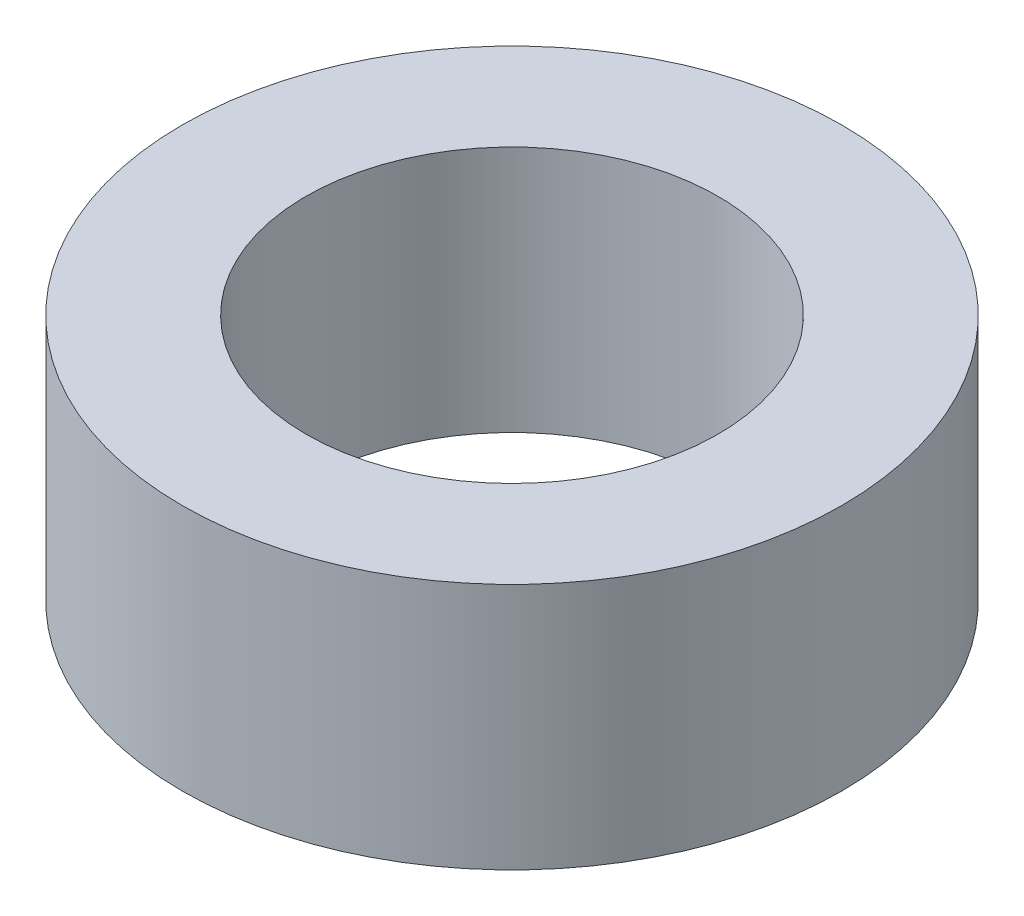
ISO-10303-21;
HEADER;
FILE_DESCRIPTION(('STEP AP214'),'2;1');
FILE_NAME('part.step','',(''),(''),'','','');
FILE_SCHEMA(('AUTOMOTIVE_DESIGN { 1 0 10303 214 1 1 1 1 }'));
ENDSEC;
DATA;
#1=APPLICATION_CONTEXT('core data for automotive mechanical design processes');
#2=APPLICATION_PROTOCOL_DEFINITION('international standard','automotive_design',2000,#1);
#3=PRODUCT_CONTEXT('',#1,'mechanical');
#4=PRODUCT('Part','Part','',(#3));
#5=PRODUCT_RELATED_PRODUCT_CATEGORY('part','',(#4));
#6=PRODUCT_DEFINITION_FORMATION('','',#4);
#7=PRODUCT_DEFINITION_CONTEXT('part definition',#1,'design');
#8=PRODUCT_DEFINITION('design','',#6,#7);
#9=PRODUCT_DEFINITION_SHAPE('','',#8);
#10=(LENGTH_UNIT() NAMED_UNIT(*) SI_UNIT(.MILLI.,.METRE.));
#11=(NAMED_UNIT(*) PLANE_ANGLE_UNIT() SI_UNIT($,.RADIAN.));
#12=(NAMED_UNIT(*) SI_UNIT($,.STERADIAN.) SOLID_ANGLE_UNIT());
#13=UNCERTAINTY_MEASURE_WITH_UNIT(LENGTH_MEASURE(1.E-05),#10,'distance_accuracy_value','');
#14=(GEOMETRIC_REPRESENTATION_CONTEXT(3) GLOBAL_UNCERTAINTY_ASSIGNED_CONTEXT((#13)) GLOBAL_UNIT_ASSIGNED_CONTEXT((#10,
#11,#12)) REPRESENTATION_CONTEXT('',''));
#15=CARTESIAN_POINT('',(0.,0.,0.));
#16=DIRECTION('',(0.,0.,1.));
#17=DIRECTION('',(1.,0.,0.));
#18=AXIS2_PLACEMENT_3D('',#15,#16,#17);
#19=CARTESIAN_POINT('',(0.,6.,0.));
#20=DIRECTION('',(0.,1.,0.));
#21=DIRECTION('',(0.,0.,1.));
#22=AXIS2_PLACEMENT_3D('',#19,#20,#21);
#23=PLANE('',#22);
#24=CARTESIAN_POINT('',(0.,6.,0.));
#25=DIRECTION('',(0.,1.,0.));
#26=DIRECTION('',(0.,0.,1.));
#27=AXIS2_PLACEMENT_3D('',#24,#25,#26);
#28=CIRCLE('',#27,8.);
#29=CARTESIAN_POINT('',(0.,6.,8.));
#30=VERTEX_POINT('',#29);
#31=EDGE_CURVE('E11',#30,#30,#28,.T.);
#32=ORIENTED_EDGE('',*,*,#31,.T.);
#33=EDGE_LOOP('',(#32));
#34=FACE_BOUND('',#33,.T.);
#35=CARTESIAN_POINT('',(0.,6.,0.));
#36=DIRECTION('',(0.,1.,0.));
#37=DIRECTION('',(0.,0.,1.));
#38=AXIS2_PLACEMENT_3D('',#35,#36,#37);
#39=CIRCLE('',#38,5.);
#40=CARTESIAN_POINT('',(0.,6.,5.));
#41=VERTEX_POINT('',#40);
#42=EDGE_CURVE('E50',#41,#41,#39,.T.);
#43=ORIENTED_EDGE('',*,*,#42,.F.);
#44=EDGE_LOOP('',(#43));
#45=FACE_BOUND('',#44,.T.);
#46=ADVANCED_FACE('F37',(#34,#45),#23,.T.);
#47=CARTESIAN_POINT('',(0.,0.,0.));
#48=DIRECTION('',(0.,1.,0.));
#49=DIRECTION('',(0.,0.,1.));
#50=AXIS2_PLACEMENT_3D('',#47,#48,#49);
#51=PLANE('',#50);
#52=CARTESIAN_POINT('',(0.,0.,0.));
#53=DIRECTION('',(0.,1.,0.));
#54=DIRECTION('',(0.,0.,1.));
#55=AXIS2_PLACEMENT_3D('',#52,#53,#54);
#56=CIRCLE('',#55,8.);
#57=CARTESIAN_POINT('',(0.,0.,8.));
#58=VERTEX_POINT('',#57);
#59=EDGE_CURVE('E41',#58,#58,#56,.T.);
#60=ORIENTED_EDGE('',*,*,#59,.F.);
#61=EDGE_LOOP('',(#60));
#62=FACE_BOUND('',#61,.T.);
#63=CARTESIAN_POINT('',(0.,0.,0.));
#64=DIRECTION('',(0.,1.,0.));
#65=DIRECTION('',(0.,0.,1.));
#66=AXIS2_PLACEMENT_3D('',#63,#64,#65);
#67=CIRCLE('',#66,5.);
#68=CARTESIAN_POINT('',(0.,0.,5.));
#69=VERTEX_POINT('',#68);
#70=EDGE_CURVE('E51',#69,#69,#67,.T.);
#71=ORIENTED_EDGE('',*,*,#70,.T.);
#72=EDGE_LOOP('',(#71));
#73=FACE_BOUND('',#72,.T.);
#74=ADVANCED_FACE('F63',(#62,#73),#51,.F.);
#75=CARTESIAN_POINT('',(0.,6.,0.));
#76=DIRECTION('',(0.,-1.,0.));
#77=DIRECTION('',(0.,0.,-1.));
#78=AXIS2_PLACEMENT_3D('',#75,#76,#77);
#79=CYLINDRICAL_SURFACE('',#78,8.);
#80=ORIENTED_EDGE('',*,*,#31,.F.);
#81=EDGE_LOOP('',(#80));
#82=FACE_BOUND('',#81,.T.);
#83=ORIENTED_EDGE('',*,*,#59,.T.);
#84=EDGE_LOOP('',(#83));
#85=FACE_BOUND('',#84,.T.);
#86=ADVANCED_FACE('F39',(#82,#85),#79,.T.);
#87=CARTESIAN_POINT('',(0.,6.,0.));
#88=DIRECTION('',(0.,-1.,0.));
#89=DIRECTION('',(0.,0.,-1.));
#90=AXIS2_PLACEMENT_3D('',#87,#88,#89);
#91=CYLINDRICAL_SURFACE('',#90,5.);
#92=ORIENTED_EDGE('',*,*,#42,.T.);
#93=EDGE_LOOP('',(#92));
#94=FACE_BOUND('',#93,.T.);
#95=ORIENTED_EDGE('',*,*,#70,.F.);
#96=EDGE_LOOP('',(#95));
#97=FACE_BOUND('',#96,.T.);
#98=ADVANCED_FACE('F59',(#94,#97),#91,.F.);
#99=CLOSED_SHELL('',(#46,#74,#86,#98));
#100=MANIFOLD_SOLID_BREP('B2',#99);
#101=ADVANCED_BREP_SHAPE_REPRESENTATION('',(#18,#100),#14);
#102=SHAPE_DEFINITION_REPRESENTATION(#9,#101);
ENDSEC;
END-ISO-10303-21;
